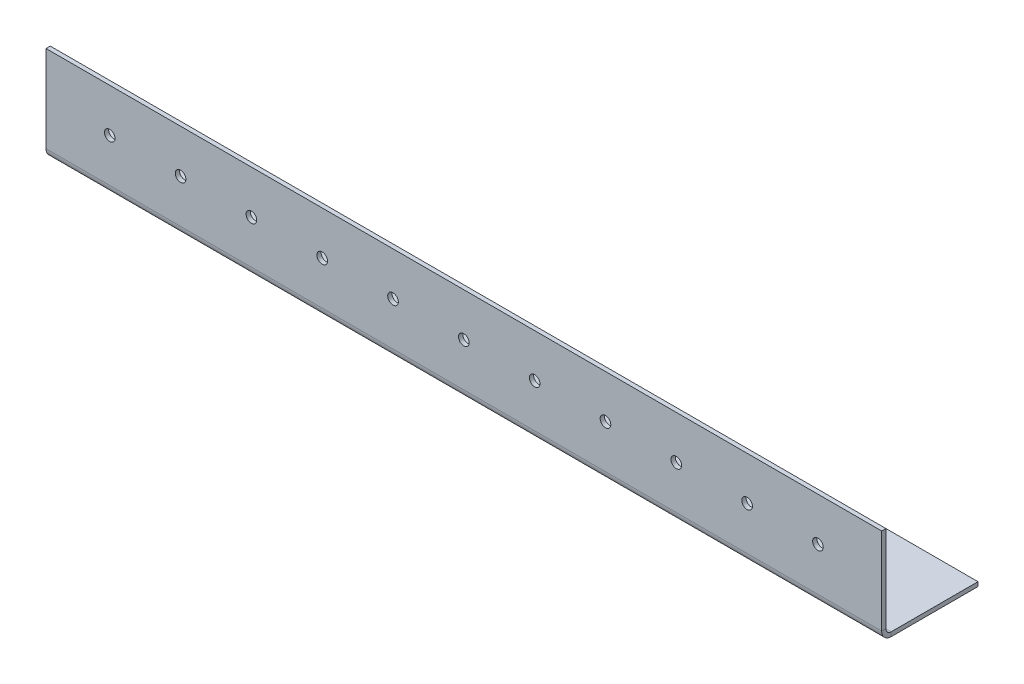
ISO-10303-21;
HEADER;
FILE_DESCRIPTION(('STEP AP214'),'2;1');
FILE_NAME('part.step','',(''),(''),'','','');
FILE_SCHEMA(('AUTOMOTIVE_DESIGN { 1 0 10303 214 1 1 1 1 }'));
ENDSEC;
DATA;
#1=APPLICATION_CONTEXT('core data for automotive mechanical design processes');
#2=APPLICATION_PROTOCOL_DEFINITION('international standard','automotive_design',2000,#1);
#3=PRODUCT_CONTEXT('',#1,'mechanical');
#4=PRODUCT('Part','Part','',(#3));
#5=PRODUCT_RELATED_PRODUCT_CATEGORY('part','',(#4));
#6=PRODUCT_DEFINITION_FORMATION('','',#4);
#7=PRODUCT_DEFINITION_CONTEXT('part definition',#1,'design');
#8=PRODUCT_DEFINITION('design','',#6,#7);
#9=PRODUCT_DEFINITION_SHAPE('','',#8);
#10=(LENGTH_UNIT() NAMED_UNIT(*) SI_UNIT(.MILLI.,.METRE.));
#11=(NAMED_UNIT(*) PLANE_ANGLE_UNIT() SI_UNIT($,.RADIAN.));
#12=(NAMED_UNIT(*) SI_UNIT($,.STERADIAN.) SOLID_ANGLE_UNIT());
#13=UNCERTAINTY_MEASURE_WITH_UNIT(LENGTH_MEASURE(1.E-05),#10,'distance_accuracy_value','');
#14=(GEOMETRIC_REPRESENTATION_CONTEXT(3) GLOBAL_UNCERTAINTY_ASSIGNED_CONTEXT((#13)) GLOBAL_UNIT_ASSIGNED_CONTEXT((#10,
#11,#12)) REPRESENTATION_CONTEXT('',''));
#15=CARTESIAN_POINT('',(0.,0.,0.));
#16=DIRECTION('',(0.,0.,1.));
#17=DIRECTION('',(1.,0.,0.));
#18=AXIS2_PLACEMENT_3D('',#15,#16,#17);
#19=CARTESIAN_POINT('',(118.,-1.2,-26.));
#20=DIRECTION('',(1.,0.,0.));
#21=DIRECTION('',(0.,0.,-1.));
#22=AXIS2_PLACEMENT_3D('',#19,#20,#21);
#23=PLANE('',#22);
#24=DIRECTION('',(0.,0.,-1.));
#25=VECTOR('',#24,1.);
#26=CARTESIAN_POINT('',(118.,0.,-26.));
#27=LINE('',#26,#25);
#28=CARTESIAN_POINT('',(118.,0.,-1.5));
#29=VERTEX_POINT('',#28);
#30=CARTESIAN_POINT('',(118.,0.,-26.));
#31=VERTEX_POINT('',#30);
#32=EDGE_CURVE('E80',#29,#31,#27,.T.);
#33=ORIENTED_EDGE('',*,*,#32,.F.);
#34=DIRECTION('',(0.,-1.,0.));
#35=VECTOR('',#34,1.);
#36=CARTESIAN_POINT('',(118.,0.,-1.5));
#37=LINE('',#36,#35);
#38=CARTESIAN_POINT('',(118.,-1.19999999999999,-1.49999999999999));
#39=VERTEX_POINT('',#38);
#40=EDGE_CURVE('E98',#29,#39,#37,.T.);
#41=ORIENTED_EDGE('',*,*,#40,.T.);
#42=DIRECTION('',(0.,0.,-1.));
#43=VECTOR('',#42,1.);
#44=CARTESIAN_POINT('',(118.,-1.2,-26.));
#45=LINE('',#44,#43);
#46=CARTESIAN_POINT('',(118.,-1.2,-26.));
#47=VERTEX_POINT('',#46);
#48=EDGE_CURVE('E65',#39,#47,#45,.T.);
#49=ORIENTED_EDGE('',*,*,#48,.T.);
#50=DIRECTION('',(0.,1.,0.));
#51=VECTOR('',#50,1.);
#52=CARTESIAN_POINT('',(118.,-1.2,-26.));
#53=LINE('',#52,#51);
#54=EDGE_CURVE('E11',#47,#31,#53,.T.);
#55=ORIENTED_EDGE('',*,*,#54,.T.);
#56=EDGE_LOOP('',(#33,#41,#49,#55));
#57=FACE_BOUND('',#56,.T.);
#58=ADVANCED_FACE('F40',(#57),#23,.T.);
#59=CARTESIAN_POINT('',(0.,-1.2,0.));
#60=DIRECTION('',(0.,-1.,0.));
#61=DIRECTION('',(0.,0.,-1.));
#62=AXIS2_PLACEMENT_3D('',#59,#60,#61);
#63=PLANE('',#62);
#64=CARTESIAN_POINT('',(-100.,-1.2,-13.75));
#65=DIRECTION('',(0.,-1.,0.));
#66=DIRECTION('',(0.,0.,-1.));
#67=AXIS2_PLACEMENT_3D('',#64,#65,#66);
#68=CIRCLE('',#67,1.5);
#69=CARTESIAN_POINT('',(-100.,-1.2,-15.25));
#70=VERTEX_POINT('',#69);
#71=EDGE_CURVE('E108',#70,#70,#68,.T.);
#72=ORIENTED_EDGE('',*,*,#71,.F.);
#73=EDGE_LOOP('',(#72));
#74=FACE_BOUND('',#73,.T.);
#75=CARTESIAN_POINT('',(-80.,-1.2,-13.75));
#76=DIRECTION('',(0.,-1.,0.));
#77=DIRECTION('',(0.,0.,-1.));
#78=AXIS2_PLACEMENT_3D('',#75,#76,#77);
#79=CIRCLE('',#78,1.5);
#80=CARTESIAN_POINT('',(-80.,-1.2,-15.25));
#81=VERTEX_POINT('',#80);
#82=EDGE_CURVE('E755',#81,#81,#79,.T.);
#83=ORIENTED_EDGE('',*,*,#82,.F.);
#84=EDGE_LOOP('',(#83));
#85=FACE_BOUND('',#84,.T.);
#86=CARTESIAN_POINT('',(-60.,-1.2,-13.75));
#87=DIRECTION('',(0.,-1.,0.));
#88=DIRECTION('',(0.,0.,-1.));
#89=AXIS2_PLACEMENT_3D('',#86,#87,#88);
#90=CIRCLE('',#89,1.5);
#91=CARTESIAN_POINT('',(-60.,-1.2,-15.25));
#92=VERTEX_POINT('',#91);
#93=EDGE_CURVE('E758',#92,#92,#90,.T.);
#94=ORIENTED_EDGE('',*,*,#93,.F.);
#95=EDGE_LOOP('',(#94));
#96=FACE_BOUND('',#95,.T.);
#97=CARTESIAN_POINT('',(-40.,-1.2,-13.75));
#98=DIRECTION('',(0.,-1.,0.));
#99=DIRECTION('',(0.,0.,-1.));
#100=AXIS2_PLACEMENT_3D('',#97,#98,#99);
#101=CIRCLE('',#100,1.5);
#102=CARTESIAN_POINT('',(-40.,-1.2,-15.25));
#103=VERTEX_POINT('',#102);
#104=EDGE_CURVE('E761',#103,#103,#101,.T.);
#105=ORIENTED_EDGE('',*,*,#104,.F.);
#106=EDGE_LOOP('',(#105));
#107=FACE_BOUND('',#106,.T.);
#108=CARTESIAN_POINT('',(-20.,-1.2,-13.75));
#109=DIRECTION('',(0.,-1.,0.));
#110=DIRECTION('',(0.,0.,-1.));
#111=AXIS2_PLACEMENT_3D('',#108,#109,#110);
#112=CIRCLE('',#111,1.5);
#113=CARTESIAN_POINT('',(-20.,-1.2,-15.25));
#114=VERTEX_POINT('',#113);
#115=EDGE_CURVE('E764',#114,#114,#112,.T.);
#116=ORIENTED_EDGE('',*,*,#115,.F.);
#117=EDGE_LOOP('',(#116));
#118=FACE_BOUND('',#117,.T.);
#119=CARTESIAN_POINT('',(0.,-1.2,-13.75));
#120=DIRECTION('',(0.,-1.,0.));
#121=DIRECTION('',(0.,0.,-1.));
#122=AXIS2_PLACEMENT_3D('',#119,#120,#121);
#123=CIRCLE('',#122,1.5);
#124=CARTESIAN_POINT('',(0.,-1.2,-15.25));
#125=VERTEX_POINT('',#124);
#126=EDGE_CURVE('E767',#125,#125,#123,.T.);
#127=ORIENTED_EDGE('',*,*,#126,.F.);
#128=EDGE_LOOP('',(#127));
#129=FACE_BOUND('',#128,.T.);
#130=CARTESIAN_POINT('',(20.,-1.2,-13.75));
#131=DIRECTION('',(0.,-1.,0.));
#132=DIRECTION('',(0.,0.,-1.));
#133=AXIS2_PLACEMENT_3D('',#130,#131,#132);
#134=CIRCLE('',#133,1.5);
#135=CARTESIAN_POINT('',(20.,-1.2,-15.25));
#136=VERTEX_POINT('',#135);
#137=EDGE_CURVE('E770',#136,#136,#134,.T.);
#138=ORIENTED_EDGE('',*,*,#137,.F.);
#139=EDGE_LOOP('',(#138));
#140=FACE_BOUND('',#139,.T.);
#141=CARTESIAN_POINT('',(40.,-1.2,-13.75));
#142=DIRECTION('',(0.,-1.,0.));
#143=DIRECTION('',(0.,0.,-1.));
#144=AXIS2_PLACEMENT_3D('',#141,#142,#143);
#145=CIRCLE('',#144,1.5);
#146=CARTESIAN_POINT('',(40.,-1.2,-15.25));
#147=VERTEX_POINT('',#146);
#148=EDGE_CURVE('E773',#147,#147,#145,.T.);
#149=ORIENTED_EDGE('',*,*,#148,.F.);
#150=EDGE_LOOP('',(#149));
#151=FACE_BOUND('',#150,.T.);
#152=CARTESIAN_POINT('',(60.,-1.2,-13.75));
#153=DIRECTION('',(0.,-1.,0.));
#154=DIRECTION('',(0.,0.,-1.));
#155=AXIS2_PLACEMENT_3D('',#152,#153,#154);
#156=CIRCLE('',#155,1.5);
#157=CARTESIAN_POINT('',(60.,-1.2,-15.25));
#158=VERTEX_POINT('',#157);
#159=EDGE_CURVE('E180',#158,#158,#156,.T.);
#160=ORIENTED_EDGE('',*,*,#159,.F.);
#161=EDGE_LOOP('',(#160));
#162=FACE_BOUND('',#161,.T.);
#163=CARTESIAN_POINT('',(80.,-1.2,-13.75));
#164=DIRECTION('',(0.,-1.,0.));
#165=DIRECTION('',(0.,0.,-1.));
#166=AXIS2_PLACEMENT_3D('',#163,#164,#165);
#167=CIRCLE('',#166,1.5);
#168=CARTESIAN_POINT('',(80.,-1.2,-15.25));
#169=VERTEX_POINT('',#168);
#170=EDGE_CURVE('E175',#169,#169,#167,.T.);
#171=ORIENTED_EDGE('',*,*,#170,.F.);
#172=EDGE_LOOP('',(#171));
#173=FACE_BOUND('',#172,.T.);
#174=CARTESIAN_POINT('',(100.,-1.2,-13.75));
#175=DIRECTION('',(0.,-1.,0.));
#176=DIRECTION('',(0.,0.,-1.));
#177=AXIS2_PLACEMENT_3D('',#174,#175,#176);
#178=CIRCLE('',#177,1.5);
#179=CARTESIAN_POINT('',(100.,-1.2,-15.25));
#180=VERTEX_POINT('',#179);
#181=EDGE_CURVE('E171',#180,#180,#178,.T.);
#182=ORIENTED_EDGE('',*,*,#181,.F.);
#183=EDGE_LOOP('',(#182));
#184=FACE_BOUND('',#183,.T.);
#185=ORIENTED_EDGE('',*,*,#48,.F.);
#186=DIRECTION('',(1.,0.,0.));
#187=VECTOR('',#186,1.);
#188=CARTESIAN_POINT('',(118.,-1.19999999999999,-1.49999999999999));
#189=LINE('',#188,#187);
#190=CARTESIAN_POINT('',(-118.,-1.2,-1.49999999999999));
#191=VERTEX_POINT('',#190);
#192=EDGE_CURVE('E219',#39,#191,#189,.F.);
#193=ORIENTED_EDGE('',*,*,#192,.T.);
#194=DIRECTION('',(0.,0.,1.));
#195=VECTOR('',#194,1.);
#196=CARTESIAN_POINT('',(-118.,-1.2,-26.));
#197=LINE('',#196,#195);
#198=CARTESIAN_POINT('',(-118.,-1.2,-26.));
#199=VERTEX_POINT('',#198);
#200=EDGE_CURVE('E233',#199,#191,#197,.T.);
#201=ORIENTED_EDGE('',*,*,#200,.F.);
#202=DIRECTION('',(-1.,0.,0.));
#203=VECTOR('',#202,1.);
#204=CARTESIAN_POINT('',(-118.,-1.2,-26.));
#205=LINE('',#204,#203);
#206=EDGE_CURVE('E88',#47,#199,#205,.T.);
#207=ORIENTED_EDGE('',*,*,#206,.F.);
#208=EDGE_LOOP('',(#185,#193,#201,#207));
#209=FACE_BOUND('',#208,.T.);
#210=ADVANCED_FACE('F241',(#74,#85,#96,#107,#118,#129,#140,#151,#162,#173,#184,#209),#63,.T.);
#211=CARTESIAN_POINT('',(0.,0.,0.));
#212=DIRECTION('',(0.,-1.,0.));
#213=DIRECTION('',(0.,0.,-1.));
#214=AXIS2_PLACEMENT_3D('',#211,#212,#213);
#215=PLANE('',#214);
#216=CARTESIAN_POINT('',(-100.,0.,-13.75));
#217=DIRECTION('',(0.,-1.,0.));
#218=DIRECTION('',(0.,0.,-1.));
#219=AXIS2_PLACEMENT_3D('',#216,#217,#218);
#220=CIRCLE('',#219,1.5);
#221=CARTESIAN_POINT('',(-100.,0.,-15.25));
#222=VERTEX_POINT('',#221);
#223=EDGE_CURVE('E135',#222,#222,#220,.T.);
#224=ORIENTED_EDGE('',*,*,#223,.T.);
#225=EDGE_LOOP('',(#224));
#226=FACE_BOUND('',#225,.T.);
#227=CARTESIAN_POINT('',(-80.,0.,-13.75));
#228=DIRECTION('',(0.,-1.,0.));
#229=DIRECTION('',(0.,0.,-1.));
#230=AXIS2_PLACEMENT_3D('',#227,#228,#229);
#231=CIRCLE('',#230,1.5);
#232=CARTESIAN_POINT('',(-80.,0.,-15.25));
#233=VERTEX_POINT('',#232);
#234=EDGE_CURVE('E132',#233,#233,#231,.T.);
#235=ORIENTED_EDGE('',*,*,#234,.T.);
#236=EDGE_LOOP('',(#235));
#237=FACE_BOUND('',#236,.T.);
#238=CARTESIAN_POINT('',(-60.,0.,-13.75));
#239=DIRECTION('',(0.,-1.,0.));
#240=DIRECTION('',(0.,0.,-1.));
#241=AXIS2_PLACEMENT_3D('',#238,#239,#240);
#242=CIRCLE('',#241,1.5);
#243=CARTESIAN_POINT('',(-60.,0.,-15.25));
#244=VERTEX_POINT('',#243);
#245=EDGE_CURVE('E129',#244,#244,#242,.T.);
#246=ORIENTED_EDGE('',*,*,#245,.T.);
#247=EDGE_LOOP('',(#246));
#248=FACE_BOUND('',#247,.T.);
#249=CARTESIAN_POINT('',(-40.,0.,-13.75));
#250=DIRECTION('',(0.,-1.,0.));
#251=DIRECTION('',(0.,0.,-1.));
#252=AXIS2_PLACEMENT_3D('',#249,#250,#251);
#253=CIRCLE('',#252,1.5);
#254=CARTESIAN_POINT('',(-40.,0.,-15.25));
#255=VERTEX_POINT('',#254);
#256=EDGE_CURVE('E126',#255,#255,#253,.T.);
#257=ORIENTED_EDGE('',*,*,#256,.T.);
#258=EDGE_LOOP('',(#257));
#259=FACE_BOUND('',#258,.T.);
#260=CARTESIAN_POINT('',(-20.,0.,-13.75));
#261=DIRECTION('',(0.,-1.,0.));
#262=DIRECTION('',(0.,0.,-1.));
#263=AXIS2_PLACEMENT_3D('',#260,#261,#262);
#264=CIRCLE('',#263,1.5);
#265=CARTESIAN_POINT('',(-20.,0.,-15.25));
#266=VERTEX_POINT('',#265);
#267=EDGE_CURVE('E123',#266,#266,#264,.T.);
#268=ORIENTED_EDGE('',*,*,#267,.T.);
#269=EDGE_LOOP('',(#268));
#270=FACE_BOUND('',#269,.T.);
#271=CARTESIAN_POINT('',(0.,0.,-13.75));
#272=DIRECTION('',(0.,-1.,0.));
#273=DIRECTION('',(0.,0.,-1.));
#274=AXIS2_PLACEMENT_3D('',#271,#272,#273);
#275=CIRCLE('',#274,1.5);
#276=CARTESIAN_POINT('',(0.,0.,-15.25));
#277=VERTEX_POINT('',#276);
#278=EDGE_CURVE('E120',#277,#277,#275,.T.);
#279=ORIENTED_EDGE('',*,*,#278,.T.);
#280=EDGE_LOOP('',(#279));
#281=FACE_BOUND('',#280,.T.);
#282=CARTESIAN_POINT('',(20.,0.,-13.75));
#283=DIRECTION('',(0.,-1.,0.));
#284=DIRECTION('',(0.,0.,-1.));
#285=AXIS2_PLACEMENT_3D('',#282,#283,#284);
#286=CIRCLE('',#285,1.5);
#287=CARTESIAN_POINT('',(20.,0.,-15.25));
#288=VERTEX_POINT('',#287);
#289=EDGE_CURVE('E117',#288,#288,#286,.T.);
#290=ORIENTED_EDGE('',*,*,#289,.T.);
#291=EDGE_LOOP('',(#290));
#292=FACE_BOUND('',#291,.T.);
#293=CARTESIAN_POINT('',(40.,0.,-13.75));
#294=DIRECTION('',(0.,-1.,0.));
#295=DIRECTION('',(0.,0.,-1.));
#296=AXIS2_PLACEMENT_3D('',#293,#294,#295);
#297=CIRCLE('',#296,1.5);
#298=CARTESIAN_POINT('',(40.,0.,-15.25));
#299=VERTEX_POINT('',#298);
#300=EDGE_CURVE('E114',#299,#299,#297,.T.);
#301=ORIENTED_EDGE('',*,*,#300,.T.);
#302=EDGE_LOOP('',(#301));
#303=FACE_BOUND('',#302,.T.);
#304=CARTESIAN_POINT('',(60.,0.,-13.75));
#305=DIRECTION('',(0.,-1.,0.));
#306=DIRECTION('',(0.,0.,-1.));
#307=AXIS2_PLACEMENT_3D('',#304,#305,#306);
#308=CIRCLE('',#307,1.5);
#309=CARTESIAN_POINT('',(60.,0.,-15.25));
#310=VERTEX_POINT('',#309);
#311=EDGE_CURVE('E111',#310,#310,#308,.T.);
#312=ORIENTED_EDGE('',*,*,#311,.T.);
#313=EDGE_LOOP('',(#312));
#314=FACE_BOUND('',#313,.T.);
#315=CARTESIAN_POINT('',(80.,0.,-13.75));
#316=DIRECTION('',(0.,-1.,0.));
#317=DIRECTION('',(0.,0.,-1.));
#318=AXIS2_PLACEMENT_3D('',#315,#316,#317);
#319=CIRCLE('',#318,1.5);
#320=CARTESIAN_POINT('',(80.,0.,-15.25));
#321=VERTEX_POINT('',#320);
#322=EDGE_CURVE('E107',#321,#321,#319,.T.);
#323=ORIENTED_EDGE('',*,*,#322,.T.);
#324=EDGE_LOOP('',(#323));
#325=FACE_BOUND('',#324,.T.);
#326=CARTESIAN_POINT('',(100.,0.,-13.75));
#327=DIRECTION('',(0.,-1.,0.));
#328=DIRECTION('',(0.,0.,-1.));
#329=AXIS2_PLACEMENT_3D('',#326,#327,#328);
#330=CIRCLE('',#329,1.5);
#331=CARTESIAN_POINT('',(100.,0.,-15.25));
#332=VERTEX_POINT('',#331);
#333=EDGE_CURVE('E104',#332,#332,#330,.T.);
#334=ORIENTED_EDGE('',*,*,#333,.T.);
#335=EDGE_LOOP('',(#334));
#336=FACE_BOUND('',#335,.T.);
#337=DIRECTION('',(1.,0.,0.));
#338=VECTOR('',#337,1.);
#339=CARTESIAN_POINT('',(118.,0.,-1.5));
#340=LINE('',#339,#338);
#341=CARTESIAN_POINT('',(-118.,0.,-1.49999999999998));
#342=VERTEX_POINT('',#341);
#343=EDGE_CURVE('E87',#29,#342,#340,.F.);
#344=ORIENTED_EDGE('',*,*,#343,.F.);
#345=ORIENTED_EDGE('',*,*,#32,.T.);
#346=DIRECTION('',(-1.,0.,0.));
#347=VECTOR('',#346,1.);
#348=CARTESIAN_POINT('',(-118.,0.,-26.));
#349=LINE('',#348,#347);
#350=CARTESIAN_POINT('',(-118.,0.,-26.));
#351=VERTEX_POINT('',#350);
#352=EDGE_CURVE('E84',#31,#351,#349,.T.);
#353=ORIENTED_EDGE('',*,*,#352,.T.);
#354=DIRECTION('',(0.,0.,1.));
#355=VECTOR('',#354,1.);
#356=CARTESIAN_POINT('',(-118.,0.,-26.));
#357=LINE('',#356,#355);
#358=EDGE_CURVE('E89',#351,#342,#357,.T.);
#359=ORIENTED_EDGE('',*,*,#358,.T.);
#360=EDGE_LOOP('',(#344,#345,#353,#359));
#361=FACE_BOUND('',#360,.T.);
#362=ADVANCED_FACE('F81',(#226,#237,#248,#259,#270,#281,#292,#303,#314,#325,#336,#361),#215,.F.);
#363=CARTESIAN_POINT('',(-118.,-1.2,-26.));
#364=DIRECTION('',(0.,0.,-1.));
#365=DIRECTION('',(-1.,0.,0.));
#366=AXIS2_PLACEMENT_3D('',#363,#364,#365);
#367=PLANE('',#366);
#368=ORIENTED_EDGE('',*,*,#352,.F.);
#369=ORIENTED_EDGE('',*,*,#54,.F.);
#370=ORIENTED_EDGE('',*,*,#206,.T.);
#371=DIRECTION('',(0.,1.,0.));
#372=VECTOR('',#371,1.);
#373=CARTESIAN_POINT('',(-118.,-1.2,-26.));
#374=LINE('',#373,#372);
#375=EDGE_CURVE('E49',#199,#351,#374,.T.);
#376=ORIENTED_EDGE('',*,*,#375,.T.);
#377=EDGE_LOOP('',(#368,#369,#370,#376));
#378=FACE_BOUND('',#377,.T.);
#379=ADVANCED_FACE('F42',(#378),#367,.T.);
#380=CARTESIAN_POINT('',(-118.,-1.2,-26.));
#381=DIRECTION('',(-1.,0.,0.));
#382=DIRECTION('',(0.,0.,1.));
#383=AXIS2_PLACEMENT_3D('',#380,#381,#382);
#384=PLANE('',#383);
#385=DIRECTION('',(0.,-1.,0.));
#386=VECTOR('',#385,1.);
#387=CARTESIAN_POINT('',(-118.,0.,-1.49999999999998));
#388=LINE('',#387,#386);
#389=EDGE_CURVE('E95',#342,#191,#388,.T.);
#390=ORIENTED_EDGE('',*,*,#389,.F.);
#391=ORIENTED_EDGE('',*,*,#358,.F.);
#392=ORIENTED_EDGE('',*,*,#375,.F.);
#393=ORIENTED_EDGE('',*,*,#200,.T.);
#394=EDGE_LOOP('',(#390,#391,#392,#393));
#395=FACE_BOUND('',#394,.T.);
#396=ADVANCED_FACE('F238',(#395),#384,.T.);
#397=CARTESIAN_POINT('',(-118.,1.49999999999999,-1.49999999999999));
#398=DIRECTION('',(-1.,0.,0.));
#399=DIRECTION('',(0.,0.,1.));
#400=AXIS2_PLACEMENT_3D('',#397,#398,#399);
#401=PLANE('',#400);
#402=DIRECTION('',(0.,0.,1.));
#403=VECTOR('',#402,1.);
#404=CARTESIAN_POINT('',(-118.,1.49999999999999,0.));
#405=LINE('',#404,#403);
#406=CARTESIAN_POINT('',(-118.,1.49999999999999,0.));
#407=VERTEX_POINT('',#406);
#408=CARTESIAN_POINT('',(-118.,1.49999999999999,1.2));
#409=VERTEX_POINT('',#408);
#410=EDGE_CURVE('E138',#407,#409,#405,.T.);
#411=ORIENTED_EDGE('',*,*,#410,.F.);
#412=CARTESIAN_POINT('',(-118.,1.49999999999999,-1.49999999999999));
#413=DIRECTION('',(1.,0.,0.));
#414=DIRECTION('',(0.,0.,-1.));
#415=AXIS2_PLACEMENT_3D('',#412,#413,#414);
#416=CIRCLE('',#415,1.49999999999999);
#417=EDGE_CURVE('E226',#342,#407,#416,.F.);
#418=ORIENTED_EDGE('',*,*,#417,.F.);
#419=ORIENTED_EDGE('',*,*,#389,.T.);
#420=CARTESIAN_POINT('',(-118.,1.49999999999999,-1.49999999999999));
#421=DIRECTION('',(1.,0.,0.));
#422=DIRECTION('',(0.,0.,-1.));
#423=AXIS2_PLACEMENT_3D('',#420,#421,#422);
#424=CIRCLE('',#423,2.69999999999999);
#425=EDGE_CURVE('E57',#191,#409,#424,.F.);
#426=ORIENTED_EDGE('',*,*,#425,.T.);
#427=EDGE_LOOP('',(#411,#418,#419,#426));
#428=FACE_BOUND('',#427,.T.);
#429=ADVANCED_FACE('F292',(#428),#401,.T.);
#430=CARTESIAN_POINT('',(118.,1.49999999999999,-1.50000000000001));
#431=DIRECTION('',(-1.,0.,0.));
#432=DIRECTION('',(0.,0.,1.));
#433=AXIS2_PLACEMENT_3D('',#430,#431,#432);
#434=PLANE('',#433);
#435=CARTESIAN_POINT('',(118.,1.49999999999999,-1.50000000000001));
#436=DIRECTION('',(1.,0.,0.));
#437=DIRECTION('',(0.,0.,-1.));
#438=AXIS2_PLACEMENT_3D('',#435,#436,#437);
#439=CIRCLE('',#438,1.49999999999999);
#440=CARTESIAN_POINT('',(118.,1.49999999999999,0.));
#441=VERTEX_POINT('',#440);
#442=EDGE_CURVE('E218',#441,#29,#439,.T.);
#443=ORIENTED_EDGE('',*,*,#442,.F.);
#444=DIRECTION('',(0.,0.,1.));
#445=VECTOR('',#444,1.);
#446=CARTESIAN_POINT('',(118.,1.49999999999999,0.));
#447=LINE('',#446,#445);
#448=CARTESIAN_POINT('',(118.,1.49999999999999,1.2));
#449=VERTEX_POINT('',#448);
#450=EDGE_CURVE('E187',#441,#449,#447,.T.);
#451=ORIENTED_EDGE('',*,*,#450,.T.);
#452=CARTESIAN_POINT('',(118.,1.49999999999999,-1.50000000000001));
#453=DIRECTION('',(1.,0.,0.));
#454=DIRECTION('',(0.,0.,-1.));
#455=AXIS2_PLACEMENT_3D('',#452,#453,#454);
#456=CIRCLE('',#455,2.69999999999999);
#457=EDGE_CURVE('E222',#449,#39,#456,.T.);
#458=ORIENTED_EDGE('',*,*,#457,.T.);
#459=ORIENTED_EDGE('',*,*,#40,.F.);
#460=EDGE_LOOP('',(#443,#451,#458,#459));
#461=FACE_BOUND('',#460,.T.);
#462=ADVANCED_FACE('F250',(#461),#434,.F.);
#463=CARTESIAN_POINT('',(118.,1.49999999999999,-1.50000000000001));
#464=DIRECTION('',(1.,0.,0.));
#465=DIRECTION('',(0.,0.,1.));
#466=AXIS2_PLACEMENT_3D('',#463,#464,#465);
#467=CYLINDRICAL_SURFACE('',#466,2.69999999999999);
#468=ORIENTED_EDGE('',*,*,#192,.F.);
#469=ORIENTED_EDGE('',*,*,#457,.F.);
#470=DIRECTION('',(-1.,0.,0.));
#471=VECTOR('',#470,1.);
#472=CARTESIAN_POINT('',(0.,1.49999999999999,1.2));
#473=LINE('',#472,#471);
#474=EDGE_CURVE('E190',#449,#409,#473,.T.);
#475=ORIENTED_EDGE('',*,*,#474,.T.);
#476=ORIENTED_EDGE('',*,*,#425,.F.);
#477=EDGE_LOOP('',(#468,#469,#475,#476));
#478=FACE_BOUND('',#477,.T.);
#479=ADVANCED_FACE('F243',(#478),#467,.T.);
#480=CARTESIAN_POINT('',(118.,1.49999999999999,-1.50000000000001));
#481=DIRECTION('',(1.,0.,0.));
#482=DIRECTION('',(0.,0.,1.));
#483=AXIS2_PLACEMENT_3D('',#480,#481,#482);
#484=CYLINDRICAL_SURFACE('',#483,1.49999999999999);
#485=ORIENTED_EDGE('',*,*,#343,.T.);
#486=ORIENTED_EDGE('',*,*,#417,.T.);
#487=DIRECTION('',(1.,0.,0.));
#488=VECTOR('',#487,1.);
#489=CARTESIAN_POINT('',(-118.,1.49999999999999,0.));
#490=LINE('',#489,#488);
#491=EDGE_CURVE('E184',#407,#441,#490,.T.);
#492=ORIENTED_EDGE('',*,*,#491,.T.);
#493=ORIENTED_EDGE('',*,*,#442,.T.);
#494=EDGE_LOOP('',(#485,#486,#492,#493));
#495=FACE_BOUND('',#494,.T.);
#496=ADVANCED_FACE('F284',(#495),#484,.F.);
#497=CARTESIAN_POINT('',(118.,26.,1.2));
#498=DIRECTION('',(-1.,0.,0.));
#499=DIRECTION('',(0.,0.,1.));
#500=AXIS2_PLACEMENT_3D('',#497,#498,#499);
#501=PLANE('',#500);
#502=ORIENTED_EDGE('',*,*,#450,.F.);
#503=DIRECTION('',(0.,1.,0.));
#504=VECTOR('',#503,1.);
#505=CARTESIAN_POINT('',(118.,26.,0.));
#506=LINE('',#505,#504);
#507=CARTESIAN_POINT('',(118.,26.,0.));
#508=VERTEX_POINT('',#507);
#509=EDGE_CURVE('E194',#441,#508,#506,.T.);
#510=ORIENTED_EDGE('',*,*,#509,.T.);
#511=DIRECTION('',(0.,0.,-1.));
#512=VECTOR('',#511,1.);
#513=CARTESIAN_POINT('',(118.,26.,1.2));
#514=LINE('',#513,#512);
#515=CARTESIAN_POINT('',(118.,26.,1.2));
#516=VERTEX_POINT('',#515);
#517=EDGE_CURVE('E215',#516,#508,#514,.T.);
#518=ORIENTED_EDGE('',*,*,#517,.F.);
#519=DIRECTION('',(0.,1.,0.));
#520=VECTOR('',#519,1.);
#521=CARTESIAN_POINT('',(118.,26.,1.2));
#522=LINE('',#521,#520);
#523=EDGE_CURVE('E195',#449,#516,#522,.T.);
#524=ORIENTED_EDGE('',*,*,#523,.F.);
#525=EDGE_LOOP('',(#502,#510,#518,#524));
#526=FACE_BOUND('',#525,.T.);
#527=ADVANCED_FACE('F264',(#526),#501,.F.);
#528=CARTESIAN_POINT('',(-118.,0.,1.2));
#529=DIRECTION('',(1.,0.,0.));
#530=DIRECTION('',(0.,0.,-1.));
#531=AXIS2_PLACEMENT_3D('',#528,#529,#530);
#532=PLANE('',#531);
#533=ORIENTED_EDGE('',*,*,#410,.T.);
#534=DIRECTION('',(0.,-1.,0.));
#535=VECTOR('',#534,1.);
#536=CARTESIAN_POINT('',(-118.,0.,1.2));
#537=LINE('',#536,#535);
#538=CARTESIAN_POINT('',(-118.,26.,1.2));
#539=VERTEX_POINT('',#538);
#540=EDGE_CURVE('E202',#539,#409,#537,.T.);
#541=ORIENTED_EDGE('',*,*,#540,.F.);
#542=DIRECTION('',(0.,0.,-1.));
#543=VECTOR('',#542,1.);
#544=CARTESIAN_POINT('',(-118.,26.,1.2));
#545=LINE('',#544,#543);
#546=CARTESIAN_POINT('',(-118.,26.,0.));
#547=VERTEX_POINT('',#546);
#548=EDGE_CURVE('E205',#539,#547,#545,.T.);
#549=ORIENTED_EDGE('',*,*,#548,.T.);
#550=DIRECTION('',(0.,-1.,0.));
#551=VECTOR('',#550,1.);
#552=CARTESIAN_POINT('',(-118.,0.,0.));
#553=LINE('',#552,#551);
#554=EDGE_CURVE('E199',#547,#407,#553,.T.);
#555=ORIENTED_EDGE('',*,*,#554,.T.);
#556=EDGE_LOOP('',(#533,#541,#549,#555));
#557=FACE_BOUND('',#556,.T.);
#558=ADVANCED_FACE('F290',(#557),#532,.F.);
#559=CARTESIAN_POINT('',(0.,0.,1.2));
#560=DIRECTION('',(0.,0.,-1.));
#561=DIRECTION('',(-1.,0.,0.));
#562=AXIS2_PLACEMENT_3D('',#559,#560,#561);
#563=PLANE('',#562);
#564=CARTESIAN_POINT('',(-100.,13.75,1.2));
#565=DIRECTION('',(0.,0.,1.));
#566=DIRECTION('',(1.,0.,0.));
#567=AXIS2_PLACEMENT_3D('',#564,#565,#566);
#568=CIRCLE('',#567,1.5);
#569=CARTESIAN_POINT('',(-98.5,13.75,1.2));
#570=VERTEX_POINT('',#569);
#571=EDGE_CURVE('E143',#570,#570,#568,.T.);
#572=ORIENTED_EDGE('',*,*,#571,.F.);
#573=EDGE_LOOP('',(#572));
#574=FACE_BOUND('',#573,.T.);
#575=CARTESIAN_POINT('',(-80.,13.75,1.2));
#576=DIRECTION('',(0.,0.,1.));
#577=DIRECTION('',(1.,0.,0.));
#578=AXIS2_PLACEMENT_3D('',#575,#576,#577);
#579=CIRCLE('',#578,1.5);
#580=CARTESIAN_POINT('',(-78.5,13.75,1.2));
#581=VERTEX_POINT('',#580);
#582=EDGE_CURVE('E721',#581,#581,#579,.T.);
#583=ORIENTED_EDGE('',*,*,#582,.F.);
#584=EDGE_LOOP('',(#583));
#585=FACE_BOUND('',#584,.T.);
#586=CARTESIAN_POINT('',(-60.,13.75,1.2));
#587=DIRECTION('',(0.,0.,1.));
#588=DIRECTION('',(1.,0.,0.));
#589=AXIS2_PLACEMENT_3D('',#586,#587,#588);
#590=CIRCLE('',#589,1.5);
#591=CARTESIAN_POINT('',(-58.5,13.75,1.2));
#592=VERTEX_POINT('',#591);
#593=EDGE_CURVE('E724',#592,#592,#590,.T.);
#594=ORIENTED_EDGE('',*,*,#593,.F.);
#595=EDGE_LOOP('',(#594));
#596=FACE_BOUND('',#595,.T.);
#597=CARTESIAN_POINT('',(-40.,13.75,1.2));
#598=DIRECTION('',(0.,0.,1.));
#599=DIRECTION('',(1.,0.,0.));
#600=AXIS2_PLACEMENT_3D('',#597,#598,#599);
#601=CIRCLE('',#600,1.5);
#602=CARTESIAN_POINT('',(-38.5,13.75,1.2));
#603=VERTEX_POINT('',#602);
#604=EDGE_CURVE('E729',#603,#603,#601,.T.);
#605=ORIENTED_EDGE('',*,*,#604,.F.);
#606=EDGE_LOOP('',(#605));
#607=FACE_BOUND('',#606,.T.);
#608=CARTESIAN_POINT('',(-20.,13.75,1.2));
#609=DIRECTION('',(0.,0.,1.));
#610=DIRECTION('',(1.,0.,0.));
#611=AXIS2_PLACEMENT_3D('',#608,#609,#610);
#612=CIRCLE('',#611,1.5);
#613=CARTESIAN_POINT('',(-18.5,13.75,1.2));
#614=VERTEX_POINT('',#613);
#615=EDGE_CURVE('E732',#614,#614,#612,.T.);
#616=ORIENTED_EDGE('',*,*,#615,.F.);
#617=EDGE_LOOP('',(#616));
#618=FACE_BOUND('',#617,.T.);
#619=CARTESIAN_POINT('',(0.,13.75,1.2));
#620=DIRECTION('',(0.,0.,1.));
#621=DIRECTION('',(1.,0.,0.));
#622=AXIS2_PLACEMENT_3D('',#619,#620,#621);
#623=CIRCLE('',#622,1.5);
#624=CARTESIAN_POINT('',(1.50000000000001,13.75,1.2));
#625=VERTEX_POINT('',#624);
#626=EDGE_CURVE('E735',#625,#625,#623,.T.);
#627=ORIENTED_EDGE('',*,*,#626,.F.);
#628=EDGE_LOOP('',(#627));
#629=FACE_BOUND('',#628,.T.);
#630=CARTESIAN_POINT('',(20.,13.75,1.2));
#631=DIRECTION('',(0.,0.,1.));
#632=DIRECTION('',(1.,0.,0.));
#633=AXIS2_PLACEMENT_3D('',#630,#631,#632);
#634=CIRCLE('',#633,1.5);
#635=CARTESIAN_POINT('',(21.5,13.75,1.2));
#636=VERTEX_POINT('',#635);
#637=EDGE_CURVE('E738',#636,#636,#634,.T.);
#638=ORIENTED_EDGE('',*,*,#637,.F.);
#639=EDGE_LOOP('',(#638));
#640=FACE_BOUND('',#639,.T.);
#641=CARTESIAN_POINT('',(40.,13.75,1.2));
#642=DIRECTION('',(0.,0.,1.));
#643=DIRECTION('',(1.,0.,0.));
#644=AXIS2_PLACEMENT_3D('',#641,#642,#643);
#645=CIRCLE('',#644,1.5);
#646=CARTESIAN_POINT('',(41.5,13.75,1.2));
#647=VERTEX_POINT('',#646);
#648=EDGE_CURVE('E741',#647,#647,#645,.T.);
#649=ORIENTED_EDGE('',*,*,#648,.F.);
#650=EDGE_LOOP('',(#649));
#651=FACE_BOUND('',#650,.T.);
#652=CARTESIAN_POINT('',(60.,13.75,1.2));
#653=DIRECTION('',(0.,0.,1.));
#654=DIRECTION('',(1.,0.,0.));
#655=AXIS2_PLACEMENT_3D('',#652,#653,#654);
#656=CIRCLE('',#655,1.5);
#657=CARTESIAN_POINT('',(61.5,13.75,1.2));
#658=VERTEX_POINT('',#657);
#659=EDGE_CURVE('E744',#658,#658,#656,.T.);
#660=ORIENTED_EDGE('',*,*,#659,.F.);
#661=EDGE_LOOP('',(#660));
#662=FACE_BOUND('',#661,.T.);
#663=CARTESIAN_POINT('',(80.,13.75,1.2));
#664=DIRECTION('',(0.,0.,1.));
#665=DIRECTION('',(1.,0.,0.));
#666=AXIS2_PLACEMENT_3D('',#663,#664,#665);
#667=CIRCLE('',#666,1.5);
#668=CARTESIAN_POINT('',(81.5,13.75,1.2));
#669=VERTEX_POINT('',#668);
#670=EDGE_CURVE('E747',#669,#669,#667,.T.);
#671=ORIENTED_EDGE('',*,*,#670,.F.);
#672=EDGE_LOOP('',(#671));
#673=FACE_BOUND('',#672,.T.);
#674=CARTESIAN_POINT('',(100.,13.75,1.2));
#675=DIRECTION('',(0.,0.,1.));
#676=DIRECTION('',(1.,0.,0.));
#677=AXIS2_PLACEMENT_3D('',#674,#675,#676);
#678=CIRCLE('',#677,1.5);
#679=CARTESIAN_POINT('',(101.5,13.75,1.2));
#680=VERTEX_POINT('',#679);
#681=EDGE_CURVE('E750',#680,#680,#678,.T.);
#682=ORIENTED_EDGE('',*,*,#681,.F.);
#683=EDGE_LOOP('',(#682));
#684=FACE_BOUND('',#683,.T.);
#685=ORIENTED_EDGE('',*,*,#474,.F.);
#686=ORIENTED_EDGE('',*,*,#523,.T.);
#687=DIRECTION('',(-1.,0.,0.));
#688=VECTOR('',#687,1.);
#689=CARTESIAN_POINT('',(-118.,26.,1.2));
#690=LINE('',#689,#688);
#691=EDGE_CURVE('E198',#516,#539,#690,.T.);
#692=ORIENTED_EDGE('',*,*,#691,.T.);
#693=ORIENTED_EDGE('',*,*,#540,.T.);
#694=EDGE_LOOP('',(#685,#686,#692,#693));
#695=FACE_BOUND('',#694,.T.);
#696=ADVANCED_FACE('F260',(#574,#585,#596,#607,#618,#629,#640,#651,#662,#673,#684,#695),#563,.F.);
#697=CARTESIAN_POINT('',(0.,0.,0.));
#698=DIRECTION('',(0.,0.,-1.));
#699=DIRECTION('',(-1.,0.,0.));
#700=AXIS2_PLACEMENT_3D('',#697,#698,#699);
#701=PLANE('',#700);
#702=CARTESIAN_POINT('',(-100.,13.75,0.));
#703=DIRECTION('',(0.,0.,-1.));
#704=DIRECTION('',(-1.,0.,0.));
#705=AXIS2_PLACEMENT_3D('',#702,#703,#704);
#706=CIRCLE('',#705,1.5);
#707=CARTESIAN_POINT('',(-101.5,13.75,0.));
#708=VERTEX_POINT('',#707);
#709=EDGE_CURVE('E44',#708,#708,#706,.T.);
#710=ORIENTED_EDGE('',*,*,#709,.F.);
#711=EDGE_LOOP('',(#710));
#712=FACE_BOUND('',#711,.T.);
#713=CARTESIAN_POINT('',(-80.,13.75,0.));
#714=DIRECTION('',(0.,0.,-1.));
#715=DIRECTION('',(-1.,0.,0.));
#716=AXIS2_PLACEMENT_3D('',#713,#714,#715);
#717=CIRCLE('',#716,1.5);
#718=CARTESIAN_POINT('',(-81.5,13.75,0.));
#719=VERTEX_POINT('',#718);
#720=EDGE_CURVE('E166',#719,#719,#717,.T.);
#721=ORIENTED_EDGE('',*,*,#720,.F.);
#722=EDGE_LOOP('',(#721));
#723=FACE_BOUND('',#722,.T.);
#724=CARTESIAN_POINT('',(-60.,13.75,0.));
#725=DIRECTION('',(0.,0.,-1.));
#726=DIRECTION('',(-1.,0.,0.));
#727=AXIS2_PLACEMENT_3D('',#724,#725,#726);
#728=CIRCLE('',#727,1.5);
#729=CARTESIAN_POINT('',(-61.5,13.75,0.));
#730=VERTEX_POINT('',#729);
#731=EDGE_CURVE('E164',#730,#730,#728,.T.);
#732=ORIENTED_EDGE('',*,*,#731,.F.);
#733=EDGE_LOOP('',(#732));
#734=FACE_BOUND('',#733,.T.);
#735=CARTESIAN_POINT('',(-40.,13.75,0.));
#736=DIRECTION('',(0.,0.,-1.));
#737=DIRECTION('',(-1.,0.,0.));
#738=AXIS2_PLACEMENT_3D('',#735,#736,#737);
#739=CIRCLE('',#738,1.5);
#740=CARTESIAN_POINT('',(-41.5,13.75,0.));
#741=VERTEX_POINT('',#740);
#742=EDGE_CURVE('E161',#741,#741,#739,.T.);
#743=ORIENTED_EDGE('',*,*,#742,.F.);
#744=EDGE_LOOP('',(#743));
#745=FACE_BOUND('',#744,.T.);
#746=CARTESIAN_POINT('',(-20.,13.75,0.));
#747=DIRECTION('',(0.,0.,-1.));
#748=DIRECTION('',(-1.,0.,0.));
#749=AXIS2_PLACEMENT_3D('',#746,#747,#748);
#750=CIRCLE('',#749,1.5);
#751=CARTESIAN_POINT('',(-21.5,13.75,0.));
#752=VERTEX_POINT('',#751);
#753=EDGE_CURVE('E158',#752,#752,#750,.T.);
#754=ORIENTED_EDGE('',*,*,#753,.F.);
#755=EDGE_LOOP('',(#754));
#756=FACE_BOUND('',#755,.T.);
#757=CARTESIAN_POINT('',(0.,13.75,0.));
#758=DIRECTION('',(0.,0.,-1.));
#759=DIRECTION('',(-1.,0.,0.));
#760=AXIS2_PLACEMENT_3D('',#757,#758,#759);
#761=CIRCLE('',#760,1.5);
#762=CARTESIAN_POINT('',(-1.49999999999998,13.75,0.));
#763=VERTEX_POINT('',#762);
#764=EDGE_CURVE('E155',#763,#763,#761,.T.);
#765=ORIENTED_EDGE('',*,*,#764,.F.);
#766=EDGE_LOOP('',(#765));
#767=FACE_BOUND('',#766,.T.);
#768=CARTESIAN_POINT('',(20.,13.75,0.));
#769=DIRECTION('',(0.,0.,-1.));
#770=DIRECTION('',(-1.,0.,0.));
#771=AXIS2_PLACEMENT_3D('',#768,#769,#770);
#772=CIRCLE('',#771,1.5);
#773=CARTESIAN_POINT('',(18.5,13.75,0.));
#774=VERTEX_POINT('',#773);
#775=EDGE_CURVE('E152',#774,#774,#772,.T.);
#776=ORIENTED_EDGE('',*,*,#775,.F.);
#777=EDGE_LOOP('',(#776));
#778=FACE_BOUND('',#777,.T.);
#779=CARTESIAN_POINT('',(40.,13.75,0.));
#780=DIRECTION('',(0.,0.,-1.));
#781=DIRECTION('',(-1.,0.,0.));
#782=AXIS2_PLACEMENT_3D('',#779,#780,#781);
#783=CIRCLE('',#782,1.5);
#784=CARTESIAN_POINT('',(38.5,13.75,0.));
#785=VERTEX_POINT('',#784);
#786=EDGE_CURVE('E149',#785,#785,#783,.T.);
#787=ORIENTED_EDGE('',*,*,#786,.F.);
#788=EDGE_LOOP('',(#787));
#789=FACE_BOUND('',#788,.T.);
#790=CARTESIAN_POINT('',(60.,13.75,0.));
#791=DIRECTION('',(0.,0.,-1.));
#792=DIRECTION('',(-1.,0.,0.));
#793=AXIS2_PLACEMENT_3D('',#790,#791,#792);
#794=CIRCLE('',#793,1.5);
#795=CARTESIAN_POINT('',(58.5,13.75,0.));
#796=VERTEX_POINT('',#795);
#797=EDGE_CURVE('E146',#796,#796,#794,.T.);
#798=ORIENTED_EDGE('',*,*,#797,.F.);
#799=EDGE_LOOP('',(#798));
#800=FACE_BOUND('',#799,.T.);
#801=CARTESIAN_POINT('',(80.,13.75,0.));
#802=DIRECTION('',(0.,0.,-1.));
#803=DIRECTION('',(-1.,0.,0.));
#804=AXIS2_PLACEMENT_3D('',#801,#802,#803);
#805=CIRCLE('',#804,1.5);
#806=CARTESIAN_POINT('',(78.5,13.75,0.));
#807=VERTEX_POINT('',#806);
#808=EDGE_CURVE('E142',#807,#807,#805,.T.);
#809=ORIENTED_EDGE('',*,*,#808,.F.);
#810=EDGE_LOOP('',(#809));
#811=FACE_BOUND('',#810,.T.);
#812=CARTESIAN_POINT('',(100.,13.75,0.));
#813=DIRECTION('',(0.,0.,-1.));
#814=DIRECTION('',(-1.,0.,0.));
#815=AXIS2_PLACEMENT_3D('',#812,#813,#814);
#816=CIRCLE('',#815,1.5);
#817=CARTESIAN_POINT('',(98.5,13.75,0.));
#818=VERTEX_POINT('',#817);
#819=EDGE_CURVE('E139',#818,#818,#816,.T.);
#820=ORIENTED_EDGE('',*,*,#819,.F.);
#821=EDGE_LOOP('',(#820));
#822=FACE_BOUND('',#821,.T.);
#823=ORIENTED_EDGE('',*,*,#509,.F.);
#824=ORIENTED_EDGE('',*,*,#491,.F.);
#825=ORIENTED_EDGE('',*,*,#554,.F.);
#826=DIRECTION('',(-1.,0.,0.));
#827=VECTOR('',#826,1.);
#828=CARTESIAN_POINT('',(-118.,26.,0.));
#829=LINE('',#828,#827);
#830=EDGE_CURVE('E208',#508,#547,#829,.T.);
#831=ORIENTED_EDGE('',*,*,#830,.F.);
#832=EDGE_LOOP('',(#823,#824,#825,#831));
#833=FACE_BOUND('',#832,.T.);
#834=ADVANCED_FACE('F288',(#712,#723,#734,#745,#756,#767,#778,#789,#800,#811,#822,#833),#701,.T.);
#835=CARTESIAN_POINT('',(-118.,26.,1.2));
#836=DIRECTION('',(0.,-1.,0.));
#837=DIRECTION('',(0.,0.,-1.));
#838=AXIS2_PLACEMENT_3D('',#835,#836,#837);
#839=PLANE('',#838);
#840=ORIENTED_EDGE('',*,*,#830,.T.);
#841=ORIENTED_EDGE('',*,*,#548,.F.);
#842=ORIENTED_EDGE('',*,*,#691,.F.);
#843=ORIENTED_EDGE('',*,*,#517,.T.);
#844=EDGE_LOOP('',(#840,#841,#842,#843));
#845=FACE_BOUND('',#844,.T.);
#846=ADVANCED_FACE('F272',(#845),#839,.F.);
#847=CARTESIAN_POINT('',(100.,8.8,-13.75));
#848=DIRECTION('',(0.,-1.,0.));
#849=DIRECTION('',(0.,0.,-1.));
#850=AXIS2_PLACEMENT_3D('',#847,#848,#849);
#851=CYLINDRICAL_SURFACE('',#850,1.5);
#852=ORIENTED_EDGE('',*,*,#181,.T.);
#853=EDGE_LOOP('',(#852));
#854=FACE_BOUND('',#853,.T.);
#855=ORIENTED_EDGE('',*,*,#333,.F.);
#856=EDGE_LOOP('',(#855));
#857=FACE_BOUND('',#856,.T.);
#858=ADVANCED_FACE('F336',(#854,#857),#851,.F.);
#859=CARTESIAN_POINT('',(80.,8.8,-13.75));
#860=DIRECTION('',(0.,-1.,0.));
#861=DIRECTION('',(0.,0.,-1.));
#862=AXIS2_PLACEMENT_3D('',#859,#860,#861);
#863=CYLINDRICAL_SURFACE('',#862,1.5);
#864=ORIENTED_EDGE('',*,*,#170,.T.);
#865=EDGE_LOOP('',(#864));
#866=FACE_BOUND('',#865,.T.);
#867=ORIENTED_EDGE('',*,*,#322,.F.);
#868=EDGE_LOOP('',(#867));
#869=FACE_BOUND('',#868,.T.);
#870=ADVANCED_FACE('F338',(#866,#869),#863,.F.);
#871=CARTESIAN_POINT('',(60.,8.8,-13.75));
#872=DIRECTION('',(0.,-1.,0.));
#873=DIRECTION('',(0.,0.,-1.));
#874=AXIS2_PLACEMENT_3D('',#871,#872,#873);
#875=CYLINDRICAL_SURFACE('',#874,1.5);
#876=ORIENTED_EDGE('',*,*,#159,.T.);
#877=EDGE_LOOP('',(#876));
#878=FACE_BOUND('',#877,.T.);
#879=ORIENTED_EDGE('',*,*,#311,.F.);
#880=EDGE_LOOP('',(#879));
#881=FACE_BOUND('',#880,.T.);
#882=ADVANCED_FACE('F344',(#878,#881),#875,.F.);
#883=CARTESIAN_POINT('',(40.,8.8,-13.75));
#884=DIRECTION('',(0.,-1.,0.));
#885=DIRECTION('',(0.,0.,-1.));
#886=AXIS2_PLACEMENT_3D('',#883,#884,#885);
#887=CYLINDRICAL_SURFACE('',#886,1.5);
#888=ORIENTED_EDGE('',*,*,#148,.T.);
#889=EDGE_LOOP('',(#888));
#890=FACE_BOUND('',#889,.T.);
#891=ORIENTED_EDGE('',*,*,#300,.F.);
#892=EDGE_LOOP('',(#891));
#893=FACE_BOUND('',#892,.T.);
#894=ADVANCED_FACE('F422',(#890,#893),#887,.F.);
#895=CARTESIAN_POINT('',(20.,8.8,-13.75));
#896=DIRECTION('',(0.,-1.,0.));
#897=DIRECTION('',(0.,0.,-1.));
#898=AXIS2_PLACEMENT_3D('',#895,#896,#897);
#899=CYLINDRICAL_SURFACE('',#898,1.5);
#900=ORIENTED_EDGE('',*,*,#137,.T.);
#901=EDGE_LOOP('',(#900));
#902=FACE_BOUND('',#901,.T.);
#903=ORIENTED_EDGE('',*,*,#289,.F.);
#904=EDGE_LOOP('',(#903));
#905=FACE_BOUND('',#904,.T.);
#906=ADVANCED_FACE('F432',(#902,#905),#899,.F.);
#907=CARTESIAN_POINT('',(0.,8.8,-13.75));
#908=DIRECTION('',(0.,-1.,0.));
#909=DIRECTION('',(0.,0.,-1.));
#910=AXIS2_PLACEMENT_3D('',#907,#908,#909);
#911=CYLINDRICAL_SURFACE('',#910,1.5);
#912=ORIENTED_EDGE('',*,*,#126,.T.);
#913=EDGE_LOOP('',(#912));
#914=FACE_BOUND('',#913,.T.);
#915=ORIENTED_EDGE('',*,*,#278,.F.);
#916=EDGE_LOOP('',(#915));
#917=FACE_BOUND('',#916,.T.);
#918=ADVANCED_FACE('F443',(#914,#917),#911,.F.);
#919=CARTESIAN_POINT('',(-20.,8.8,-13.75));
#920=DIRECTION('',(0.,-1.,0.));
#921=DIRECTION('',(0.,0.,-1.));
#922=AXIS2_PLACEMENT_3D('',#919,#920,#921);
#923=CYLINDRICAL_SURFACE('',#922,1.5);
#924=ORIENTED_EDGE('',*,*,#115,.T.);
#925=EDGE_LOOP('',(#924));
#926=FACE_BOUND('',#925,.T.);
#927=ORIENTED_EDGE('',*,*,#267,.F.);
#928=EDGE_LOOP('',(#927));
#929=FACE_BOUND('',#928,.T.);
#930=ADVANCED_FACE('F454',(#926,#929),#923,.F.);
#931=CARTESIAN_POINT('',(-40.,8.8,-13.75));
#932=DIRECTION('',(0.,-1.,0.));
#933=DIRECTION('',(0.,0.,-1.));
#934=AXIS2_PLACEMENT_3D('',#931,#932,#933);
#935=CYLINDRICAL_SURFACE('',#934,1.5);
#936=ORIENTED_EDGE('',*,*,#104,.T.);
#937=EDGE_LOOP('',(#936));
#938=FACE_BOUND('',#937,.T.);
#939=ORIENTED_EDGE('',*,*,#256,.F.);
#940=EDGE_LOOP('',(#939));
#941=FACE_BOUND('',#940,.T.);
#942=ADVANCED_FACE('F465',(#938,#941),#935,.F.);
#943=CARTESIAN_POINT('',(-60.,8.8,-13.75));
#944=DIRECTION('',(0.,-1.,0.));
#945=DIRECTION('',(0.,0.,-1.));
#946=AXIS2_PLACEMENT_3D('',#943,#944,#945);
#947=CYLINDRICAL_SURFACE('',#946,1.5);
#948=ORIENTED_EDGE('',*,*,#93,.T.);
#949=EDGE_LOOP('',(#948));
#950=FACE_BOUND('',#949,.T.);
#951=ORIENTED_EDGE('',*,*,#245,.F.);
#952=EDGE_LOOP('',(#951));
#953=FACE_BOUND('',#952,.T.);
#954=ADVANCED_FACE('F476',(#950,#953),#947,.F.);
#955=CARTESIAN_POINT('',(-80.,8.8,-13.75));
#956=DIRECTION('',(0.,-1.,0.));
#957=DIRECTION('',(0.,0.,-1.));
#958=AXIS2_PLACEMENT_3D('',#955,#956,#957);
#959=CYLINDRICAL_SURFACE('',#958,1.5);
#960=ORIENTED_EDGE('',*,*,#82,.T.);
#961=EDGE_LOOP('',(#960));
#962=FACE_BOUND('',#961,.T.);
#963=ORIENTED_EDGE('',*,*,#234,.F.);
#964=EDGE_LOOP('',(#963));
#965=FACE_BOUND('',#964,.T.);
#966=ADVANCED_FACE('F487',(#962,#965),#959,.F.);
#967=CARTESIAN_POINT('',(-100.,8.8,-13.75));
#968=DIRECTION('',(0.,-1.,0.));
#969=DIRECTION('',(0.,0.,-1.));
#970=AXIS2_PLACEMENT_3D('',#967,#968,#969);
#971=CYLINDRICAL_SURFACE('',#970,1.5);
#972=ORIENTED_EDGE('',*,*,#71,.T.);
#973=EDGE_LOOP('',(#972));
#974=FACE_BOUND('',#973,.T.);
#975=ORIENTED_EDGE('',*,*,#223,.F.);
#976=EDGE_LOOP('',(#975));
#977=FACE_BOUND('',#976,.T.);
#978=ADVANCED_FACE('F497',(#974,#977),#971,.F.);
#979=CARTESIAN_POINT('',(100.,13.75,-8.8));
#980=DIRECTION('',(0.,0.,1.));
#981=DIRECTION('',(1.,0.,0.));
#982=AXIS2_PLACEMENT_3D('',#979,#980,#981);
#983=CYLINDRICAL_SURFACE('',#982,1.5);
#984=ORIENTED_EDGE('',*,*,#819,.T.);
#985=EDGE_LOOP('',(#984));
#986=FACE_BOUND('',#985,.T.);
#987=ORIENTED_EDGE('',*,*,#681,.T.);
#988=EDGE_LOOP('',(#987));
#989=FACE_BOUND('',#988,.T.);
#990=ADVANCED_FACE('F507',(#986,#989),#983,.F.);
#991=CARTESIAN_POINT('',(80.,13.75,-8.8));
#992=DIRECTION('',(0.,0.,1.));
#993=DIRECTION('',(1.,0.,0.));
#994=AXIS2_PLACEMENT_3D('',#991,#992,#993);
#995=CYLINDRICAL_SURFACE('',#994,1.5);
#996=ORIENTED_EDGE('',*,*,#808,.T.);
#997=EDGE_LOOP('',(#996));
#998=FACE_BOUND('',#997,.T.);
#999=ORIENTED_EDGE('',*,*,#670,.T.);
#1000=EDGE_LOOP('',(#999));
#1001=FACE_BOUND('',#1000,.T.);
#1002=ADVANCED_FACE('F518',(#998,#1001),#995,.F.);
#1003=CARTESIAN_POINT('',(60.,13.75,-8.8));
#1004=DIRECTION('',(0.,0.,1.));
#1005=DIRECTION('',(1.,0.,0.));
#1006=AXIS2_PLACEMENT_3D('',#1003,#1004,#1005);
#1007=CYLINDRICAL_SURFACE('',#1006,1.5);
#1008=ORIENTED_EDGE('',*,*,#797,.T.);
#1009=EDGE_LOOP('',(#1008));
#1010=FACE_BOUND('',#1009,.T.);
#1011=ORIENTED_EDGE('',*,*,#659,.T.);
#1012=EDGE_LOOP('',(#1011));
#1013=FACE_BOUND('',#1012,.T.);
#1014=ADVANCED_FACE('F525',(#1010,#1013),#1007,.F.);
#1015=CARTESIAN_POINT('',(40.,13.75,-8.8));
#1016=DIRECTION('',(0.,0.,1.));
#1017=DIRECTION('',(1.,0.,0.));
#1018=AXIS2_PLACEMENT_3D('',#1015,#1016,#1017);
#1019=CYLINDRICAL_SURFACE('',#1018,1.5);
#1020=ORIENTED_EDGE('',*,*,#786,.T.);
#1021=EDGE_LOOP('',(#1020));
#1022=FACE_BOUND('',#1021,.T.);
#1023=ORIENTED_EDGE('',*,*,#648,.T.);
#1024=EDGE_LOOP('',(#1023));
#1025=FACE_BOUND('',#1024,.T.);
#1026=ADVANCED_FACE('F533',(#1022,#1025),#1019,.F.);
#1027=CARTESIAN_POINT('',(20.,13.75,-8.8));
#1028=DIRECTION('',(0.,0.,1.));
#1029=DIRECTION('',(1.,0.,0.));
#1030=AXIS2_PLACEMENT_3D('',#1027,#1028,#1029);
#1031=CYLINDRICAL_SURFACE('',#1030,1.5);
#1032=ORIENTED_EDGE('',*,*,#775,.T.);
#1033=EDGE_LOOP('',(#1032));
#1034=FACE_BOUND('',#1033,.T.);
#1035=ORIENTED_EDGE('',*,*,#637,.T.);
#1036=EDGE_LOOP('',(#1035));
#1037=FACE_BOUND('',#1036,.T.);
#1038=ADVANCED_FACE('F541',(#1034,#1037),#1031,.F.);
#1039=CARTESIAN_POINT('',(0.,13.75,-8.8));
#1040=DIRECTION('',(0.,0.,1.));
#1041=DIRECTION('',(1.,0.,0.));
#1042=AXIS2_PLACEMENT_3D('',#1039,#1040,#1041);
#1043=CYLINDRICAL_SURFACE('',#1042,1.5);
#1044=ORIENTED_EDGE('',*,*,#764,.T.);
#1045=EDGE_LOOP('',(#1044));
#1046=FACE_BOUND('',#1045,.T.);
#1047=ORIENTED_EDGE('',*,*,#626,.T.);
#1048=EDGE_LOOP('',(#1047));
#1049=FACE_BOUND('',#1048,.T.);
#1050=ADVANCED_FACE('F549',(#1046,#1049),#1043,.F.);
#1051=CARTESIAN_POINT('',(-20.,13.75,-8.8));
#1052=DIRECTION('',(0.,0.,1.));
#1053=DIRECTION('',(1.,0.,0.));
#1054=AXIS2_PLACEMENT_3D('',#1051,#1052,#1053);
#1055=CYLINDRICAL_SURFACE('',#1054,1.5);
#1056=ORIENTED_EDGE('',*,*,#753,.T.);
#1057=EDGE_LOOP('',(#1056));
#1058=FACE_BOUND('',#1057,.T.);
#1059=ORIENTED_EDGE('',*,*,#615,.T.);
#1060=EDGE_LOOP('',(#1059));
#1061=FACE_BOUND('',#1060,.T.);
#1062=ADVANCED_FACE('F557',(#1058,#1061),#1055,.F.);
#1063=CARTESIAN_POINT('',(-40.,13.75,-8.8));
#1064=DIRECTION('',(0.,0.,1.));
#1065=DIRECTION('',(1.,0.,0.));
#1066=AXIS2_PLACEMENT_3D('',#1063,#1064,#1065);
#1067=CYLINDRICAL_SURFACE('',#1066,1.5);
#1068=ORIENTED_EDGE('',*,*,#742,.T.);
#1069=EDGE_LOOP('',(#1068));
#1070=FACE_BOUND('',#1069,.T.);
#1071=ORIENTED_EDGE('',*,*,#604,.T.);
#1072=EDGE_LOOP('',(#1071));
#1073=FACE_BOUND('',#1072,.T.);
#1074=ADVANCED_FACE('F565',(#1070,#1073),#1067,.F.);
#1075=CARTESIAN_POINT('',(-60.,13.75,-8.8));
#1076=DIRECTION('',(0.,0.,1.));
#1077=DIRECTION('',(1.,0.,0.));
#1078=AXIS2_PLACEMENT_3D('',#1075,#1076,#1077);
#1079=CYLINDRICAL_SURFACE('',#1078,1.5);
#1080=ORIENTED_EDGE('',*,*,#731,.T.);
#1081=EDGE_LOOP('',(#1080));
#1082=FACE_BOUND('',#1081,.T.);
#1083=ORIENTED_EDGE('',*,*,#593,.T.);
#1084=EDGE_LOOP('',(#1083));
#1085=FACE_BOUND('',#1084,.T.);
#1086=ADVANCED_FACE('F573',(#1082,#1085),#1079,.F.);
#1087=CARTESIAN_POINT('',(-80.,13.75,-8.8));
#1088=DIRECTION('',(0.,0.,1.));
#1089=DIRECTION('',(1.,0.,0.));
#1090=AXIS2_PLACEMENT_3D('',#1087,#1088,#1089);
#1091=CYLINDRICAL_SURFACE('',#1090,1.5);
#1092=ORIENTED_EDGE('',*,*,#720,.T.);
#1093=EDGE_LOOP('',(#1092));
#1094=FACE_BOUND('',#1093,.T.);
#1095=ORIENTED_EDGE('',*,*,#582,.T.);
#1096=EDGE_LOOP('',(#1095));
#1097=FACE_BOUND('',#1096,.T.);
#1098=ADVANCED_FACE('F581',(#1094,#1097),#1091,.F.);
#1099=CARTESIAN_POINT('',(-100.,13.75,-8.8));
#1100=DIRECTION('',(0.,0.,1.));
#1101=DIRECTION('',(1.,0.,0.));
#1102=AXIS2_PLACEMENT_3D('',#1099,#1100,#1101);
#1103=CYLINDRICAL_SURFACE('',#1102,1.5);
#1104=ORIENTED_EDGE('',*,*,#709,.T.);
#1105=EDGE_LOOP('',(#1104));
#1106=FACE_BOUND('',#1105,.T.);
#1107=ORIENTED_EDGE('',*,*,#571,.T.);
#1108=EDGE_LOOP('',(#1107));
#1109=FACE_BOUND('',#1108,.T.);
#1110=ADVANCED_FACE('F589',(#1106,#1109),#1103,.F.);
#1111=CLOSED_SHELL('',(#58,#210,#362,#379,#396,#429,#462,#479,#496,#527,#558,#696,#834,#846,
#858,#870,#882,#894,#906,#918,#930,#942,#954,#966,#978,#990,#1002,#1014,#1026,#1038,#1050,#1062,
#1074,#1086,#1098,#1110));
#1112=MANIFOLD_SOLID_BREP('B2',#1111);
#1113=ADVANCED_BREP_SHAPE_REPRESENTATION('',(#18,#1112),#14);
#1114=SHAPE_DEFINITION_REPRESENTATION(#9,#1113);
ENDSEC;
END-ISO-10303-21;
